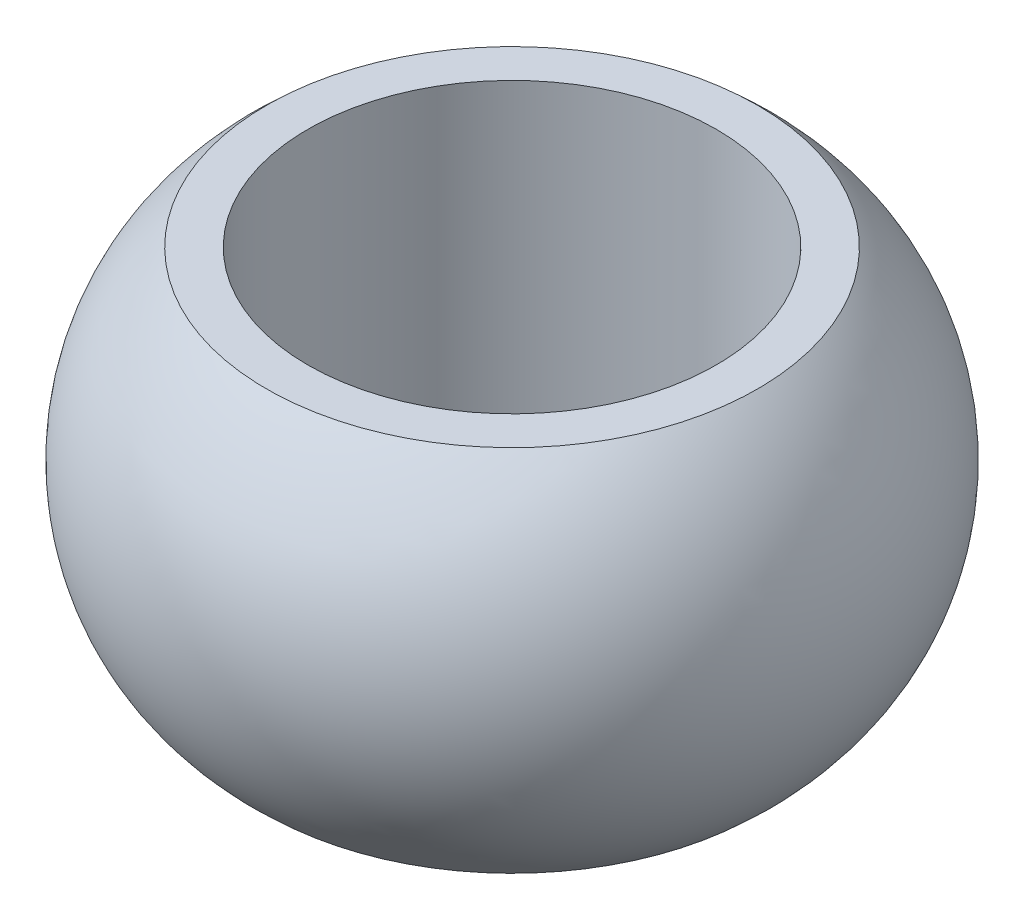
ISO-10303-21;
HEADER;
FILE_DESCRIPTION(('STEP AP214'),'2;1');
FILE_NAME('part.step','',(''),(''),'','','');
FILE_SCHEMA(('AUTOMOTIVE_DESIGN { 1 0 10303 214 1 1 1 1 }'));
ENDSEC;
DATA;
#1=APPLICATION_CONTEXT('core data for automotive mechanical design processes');
#2=APPLICATION_PROTOCOL_DEFINITION('international standard','automotive_design',2000,#1);
#3=PRODUCT_CONTEXT('',#1,'mechanical');
#4=PRODUCT('Part','Part','',(#3));
#5=PRODUCT_RELATED_PRODUCT_CATEGORY('part','',(#4));
#6=PRODUCT_DEFINITION_FORMATION('','',#4);
#7=PRODUCT_DEFINITION_CONTEXT('part definition',#1,'design');
#8=PRODUCT_DEFINITION('design','',#6,#7);
#9=PRODUCT_DEFINITION_SHAPE('','',#8);
#10=(LENGTH_UNIT() NAMED_UNIT(*) SI_UNIT(.MILLI.,.METRE.));
#11=(NAMED_UNIT(*) PLANE_ANGLE_UNIT() SI_UNIT($,.RADIAN.));
#12=(NAMED_UNIT(*) SI_UNIT($,.STERADIAN.) SOLID_ANGLE_UNIT());
#13=UNCERTAINTY_MEASURE_WITH_UNIT(LENGTH_MEASURE(1.E-05),#10,'distance_accuracy_value','');
#14=(GEOMETRIC_REPRESENTATION_CONTEXT(3) GLOBAL_UNCERTAINTY_ASSIGNED_CONTEXT((#13)) GLOBAL_UNIT_ASSIGNED_CONTEXT((#10,
#11,#12)) REPRESENTATION_CONTEXT('',''));
#15=CARTESIAN_POINT('',(0.,0.,0.));
#16=DIRECTION('',(0.,0.,1.));
#17=DIRECTION('',(1.,0.,0.));
#18=AXIS2_PLACEMENT_3D('',#15,#16,#17);
#19=CARTESIAN_POINT('',(4.93,-4.45,0.));
#20=DIRECTION('',(0.,-1.,0.));
#21=DIRECTION('',(0.,0.,-1.));
#22=AXIS2_PLACEMENT_3D('',#19,#20,#21);
#23=PLANE('',#22);
#24=CARTESIAN_POINT('',(0.,-4.45,0.));
#25=DIRECTION('',(0.,-1.,0.));
#26=DIRECTION('',(0.,0.,-1.));
#27=AXIS2_PLACEMENT_3D('',#24,#25,#26);
#28=CIRCLE('',#27,5.93);
#29=CARTESIAN_POINT('',(0.,-4.45,-5.93));
#30=VERTEX_POINT('',#29);
#31=EDGE_CURVE('E52',#30,#30,#28,.T.);
#32=ORIENTED_EDGE('',*,*,#31,.T.);
#33=EDGE_LOOP('',(#32));
#34=FACE_BOUND('',#33,.T.);
#35=CARTESIAN_POINT('',(0.,-4.45,0.));
#36=DIRECTION('',(0.,-1.,0.));
#37=DIRECTION('',(0.,0.,-1.));
#38=AXIS2_PLACEMENT_3D('',#35,#36,#37);
#39=CIRCLE('',#38,4.93);
#40=CARTESIAN_POINT('',(0.,-4.45,-4.93));
#41=VERTEX_POINT('',#40);
#42=EDGE_CURVE('E10',#41,#41,#39,.T.);
#43=ORIENTED_EDGE('',*,*,#42,.F.);
#44=EDGE_LOOP('',(#43));
#45=FACE_BOUND('',#44,.T.);
#46=ADVANCED_FACE('F39',(#34,#45),#23,.T.);
#47=CARTESIAN_POINT('',(0.,0.,0.));
#48=DIRECTION('',(0.,-1.,0.));
#49=DIRECTION('',(0.,0.,-1.));
#50=AXIS2_PLACEMENT_3D('',#47,#48,#49);
#51=CYLINDRICAL_SURFACE('',#50,4.93);
#52=ORIENTED_EDGE('',*,*,#42,.T.);
#53=EDGE_LOOP('',(#52));
#54=FACE_BOUND('',#53,.T.);
#55=CARTESIAN_POINT('',(0.,4.45,0.));
#56=DIRECTION('',(0.,-1.,0.));
#57=DIRECTION('',(0.,0.,-1.));
#58=AXIS2_PLACEMENT_3D('',#55,#56,#57);
#59=CIRCLE('',#58,4.93);
#60=CARTESIAN_POINT('',(0.,4.45,-4.93));
#61=VERTEX_POINT('',#60);
#62=EDGE_CURVE('E44',#61,#61,#59,.T.);
#63=ORIENTED_EDGE('',*,*,#62,.F.);
#64=EDGE_LOOP('',(#63));
#65=FACE_BOUND('',#64,.T.);
#66=ADVANCED_FACE('F69',(#54,#65),#51,.F.);
#67=CARTESIAN_POINT('',(4.93,4.45,0.));
#68=DIRECTION('',(0.,1.,0.));
#69=DIRECTION('',(0.,0.,1.));
#70=AXIS2_PLACEMENT_3D('',#67,#68,#69);
#71=PLANE('',#70);
#72=ORIENTED_EDGE('',*,*,#62,.T.);
#73=EDGE_LOOP('',(#72));
#74=FACE_BOUND('',#73,.T.);
#75=CARTESIAN_POINT('',(0.,4.45,0.));
#76=DIRECTION('',(0.,-1.,0.));
#77=DIRECTION('',(0.,0.,-1.));
#78=AXIS2_PLACEMENT_3D('',#75,#76,#77);
#79=CIRCLE('',#78,5.93);
#80=CARTESIAN_POINT('',(0.,4.45,-5.93));
#81=VERTEX_POINT('',#80);
#82=EDGE_CURVE('E47',#81,#81,#79,.T.);
#83=ORIENTED_EDGE('',*,*,#82,.F.);
#84=EDGE_LOOP('',(#83));
#85=FACE_BOUND('',#84,.T.);
#86=ADVANCED_FACE('F65',(#74,#85),#71,.T.);
#87=CARTESIAN_POINT('',(0.,0.,0.));
#88=DIRECTION('',(0.,-1.,0.));
#89=DIRECTION('',(0.,0.,-1.));
#90=AXIS2_PLACEMENT_3D('',#87,#88,#89);
#91=DEGENERATE_TOROIDAL_SURFACE('',#90,2.06753694581281,5.89246305418719,.T.);
#92=ORIENTED_EDGE('',*,*,#82,.T.);
#93=EDGE_LOOP('',(#92));
#94=FACE_BOUND('',#93,.T.);
#95=ORIENTED_EDGE('',*,*,#31,.F.);
#96=EDGE_LOOP('',(#95));
#97=FACE_BOUND('',#96,.T.);
#98=ADVANCED_FACE('F62',(#94,#97),#91,.T.);
#99=CLOSED_SHELL('',(#46,#66,#86,#98));
#100=MANIFOLD_SOLID_BREP('B2',#99);
#101=ADVANCED_BREP_SHAPE_REPRESENTATION('',(#18,#100),#14);
#102=SHAPE_DEFINITION_REPRESENTATION(#9,#101);
ENDSEC;
END-ISO-10303-21;
